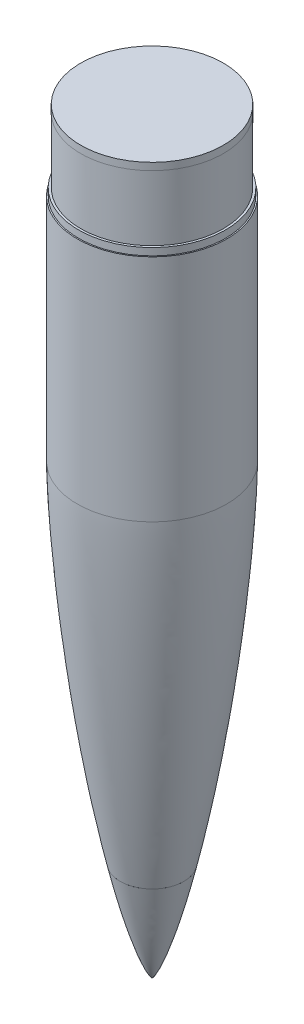
ISO-10303-21;
HEADER;
FILE_DESCRIPTION(('STEP AP214'),'2;1');
FILE_NAME('part.step','',(''),(''),'','','');
FILE_SCHEMA(('AUTOMOTIVE_DESIGN { 1 0 10303 214 1 1 1 1 }'));
ENDSEC;
DATA;
#1=APPLICATION_CONTEXT('core data for automotive mechanical design processes');
#2=APPLICATION_PROTOCOL_DEFINITION('international standard','automotive_design',2000,#1);
#3=PRODUCT_CONTEXT('',#1,'mechanical');
#4=PRODUCT('Part','Part','',(#3));
#5=PRODUCT_RELATED_PRODUCT_CATEGORY('part','',(#4));
#6=PRODUCT_DEFINITION_FORMATION('','',#4);
#7=PRODUCT_DEFINITION_CONTEXT('part definition',#1,'design');
#8=PRODUCT_DEFINITION('design','',#6,#7);
#9=PRODUCT_DEFINITION_SHAPE('','',#8);
#10=(LENGTH_UNIT() NAMED_UNIT(*) SI_UNIT(.MILLI.,.METRE.));
#11=(NAMED_UNIT(*) PLANE_ANGLE_UNIT() SI_UNIT($,.RADIAN.));
#12=(NAMED_UNIT(*) SI_UNIT($,.STERADIAN.) SOLID_ANGLE_UNIT());
#13=UNCERTAINTY_MEASURE_WITH_UNIT(LENGTH_MEASURE(1.E-05),#10,'distance_accuracy_value','');
#14=(GEOMETRIC_REPRESENTATION_CONTEXT(3) GLOBAL_UNCERTAINTY_ASSIGNED_CONTEXT((#13)) GLOBAL_UNIT_ASSIGNED_CONTEXT((#10,
#11,#12)) REPRESENTATION_CONTEXT('',''));
#15=CARTESIAN_POINT('',(0.,0.,0.));
#16=DIRECTION('',(0.,0.,1.));
#17=DIRECTION('',(1.,0.,0.));
#18=AXIS2_PLACEMENT_3D('',#15,#16,#17);
#19=CARTESIAN_POINT('',(0.,518.77656692154,0.));
#20=DIRECTION('',(0.,1.,0.));
#21=DIRECTION('',(0.,0.,1.));
#22=AXIS2_PLACEMENT_3D('',#19,#20,#21);
#23=PLANE('',#22);
#24=CARTESIAN_POINT('',(0.,518.77656692154,0.));
#25=DIRECTION('',(0.,-1.,0.));
#26=DIRECTION('',(0.,0.,-1.));
#27=AXIS2_PLACEMENT_3D('',#24,#25,#26);
#28=CIRCLE('',#27,44.3431943802182);
#29=CARTESIAN_POINT('',(0.,518.77656692154,-44.3431943802182));
#30=VERTEX_POINT('',#29);
#31=EDGE_CURVE('E76',#30,#30,#28,.T.);
#32=ORIENTED_EDGE('',*,*,#31,.T.);
#33=EDGE_LOOP('',(#32));
#34=FACE_BOUND('',#33,.T.);
#35=CARTESIAN_POINT('',(0.,518.77656692154,0.));
#36=DIRECTION('',(0.,-1.,0.));
#37=DIRECTION('',(0.,0.,-1.));
#38=AXIS2_PLACEMENT_3D('',#35,#36,#37);
#39=CIRCLE('',#38,49.3431943802182);
#40=CARTESIAN_POINT('',(0.,518.77656692154,-49.3431943802182));
#41=VERTEX_POINT('',#40);
#42=EDGE_CURVE('E59',#41,#41,#39,.T.);
#43=ORIENTED_EDGE('',*,*,#42,.F.);
#44=EDGE_LOOP('',(#43));
#45=FACE_BOUND('',#44,.T.);
#46=ADVANCED_FACE('F52',(#34,#45),#23,.T.);
#47=CARTESIAN_POINT('',(0.,-29.8063048469794,0.));
#48=DIRECTION('',(0.,-1.,0.));
#49=DIRECTION('',(0.,0.,-1.));
#50=AXIS2_PLACEMENT_3D('',#47,#48,#49);
#51=CYLINDRICAL_SURFACE('',#50,44.3431943802182);
#52=ORIENTED_EDGE('',*,*,#31,.F.);
#53=EDGE_LOOP('',(#52));
#54=FACE_BOUND('',#53,.T.);
#55=CARTESIAN_POINT('',(0.,468.772338597505,0.));
#56=DIRECTION('',(0.,-1.,0.));
#57=DIRECTION('',(0.,0.,-1.));
#58=AXIS2_PLACEMENT_3D('',#55,#56,#57);
#59=CIRCLE('',#58,44.3431943802182);
#60=CARTESIAN_POINT('',(0.,468.772338597505,-44.3431943802182));
#61=VERTEX_POINT('',#60);
#62=EDGE_CURVE('E80',#61,#61,#59,.T.);
#63=ORIENTED_EDGE('',*,*,#62,.T.);
#64=EDGE_LOOP('',(#63));
#65=FACE_BOUND('',#64,.T.);
#66=ADVANCED_FACE('F111',(#54,#65),#51,.F.);
#67=CARTESIAN_POINT('',(0.,-29.8063048469794,0.));
#68=DIRECTION('',(0.,-1.,0.));
#69=DIRECTION('',(0.,0.,-1.));
#70=AXIS2_PLACEMENT_3D('',#67,#68,#69);
#71=CYLINDRICAL_SURFACE('',#70,49.3431943802182);
#72=CARTESIAN_POINT('',(0.,473.772338597505,0.));
#73=DIRECTION('',(0.,1.,0.));
#74=DIRECTION('',(0.,0.,1.));
#75=AXIS2_PLACEMENT_3D('',#72,#73,#74);
#76=CIRCLE('',#75,49.3431943802182);
#77=CARTESIAN_POINT('',(0.,473.772338597505,49.3431943802182));
#78=VERTEX_POINT('',#77);
#79=EDGE_CURVE('E12',#78,#78,#76,.F.);
#80=ORIENTED_EDGE('',*,*,#79,.F.);
#81=EDGE_LOOP('',(#80));
#82=FACE_BOUND('',#81,.T.);
#83=ORIENTED_EDGE('',*,*,#42,.T.);
#84=EDGE_LOOP('',(#83));
#85=FACE_BOUND('',#84,.T.);
#86=ADVANCED_FACE('F116',(#82,#85),#71,.T.);
#87=CARTESIAN_POINT('',(0.,391.215771675965,0.));
#88=DIRECTION('',(0.,1.,0.));
#89=DIRECTION('',(0.,0.,1.));
#90=AXIS2_PLACEMENT_3D('',#87,#88,#89);
#91=PLANE('',#90);
#92=CARTESIAN_POINT('',(0.,391.215771675965,0.));
#93=DIRECTION('',(0.,-1.,0.));
#94=DIRECTION('',(0.,0.,-1.));
#95=AXIS2_PLACEMENT_3D('',#92,#93,#94);
#96=CIRCLE('',#95,44.33);
#97=CARTESIAN_POINT('',(0.,391.215771675965,-44.33));
#98=VERTEX_POINT('',#97);
#99=EDGE_CURVE('E85',#98,#98,#96,.T.);
#100=ORIENTED_EDGE('',*,*,#99,.F.);
#101=EDGE_LOOP('',(#100));
#102=FACE_BOUND('',#101,.T.);
#103=CARTESIAN_POINT('',(0.,391.215771675965,0.));
#104=DIRECTION('',(0.,-1.,0.));
#105=DIRECTION('',(0.,0.,-1.));
#106=AXIS2_PLACEMENT_3D('',#103,#104,#105);
#107=CIRCLE('',#106,49.33);
#108=CARTESIAN_POINT('',(0.,391.215771675965,-49.33));
#109=VERTEX_POINT('',#108);
#110=EDGE_CURVE('E68',#109,#109,#107,.T.);
#111=ORIENTED_EDGE('',*,*,#110,.T.);
#112=EDGE_LOOP('',(#111));
#113=FACE_BOUND('',#112,.T.);
#114=ADVANCED_FACE('F92',(#102,#113),#91,.F.);
#115=CARTESIAN_POINT('',(0.,391.215771675965,0.));
#116=DIRECTION('',(0.,1.,0.));
#117=DIRECTION('',(0.,0.,1.));
#118=AXIS2_PLACEMENT_3D('',#115,#116,#117);
#119=CONICAL_SURFACE('',#118,44.33,0.000170125891521534);
#120=ORIENTED_EDGE('',*,*,#62,.F.);
#121=EDGE_LOOP('',(#120));
#122=FACE_BOUND('',#121,.T.);
#123=ORIENTED_EDGE('',*,*,#99,.T.);
#124=EDGE_LOOP('',(#123));
#125=FACE_BOUND('',#124,.T.);
#126=ADVANCED_FACE('F98',(#122,#125),#119,.F.);
#127=CARTESIAN_POINT('',(0.,468.772338597505,0.));
#128=DIRECTION('',(0.,1.,0.));
#129=DIRECTION('',(0.,0.,1.));
#130=AXIS2_PLACEMENT_3D('',#127,#128,#129);
#131=CONICAL_SURFACE('',#130,49.3431943802182,0.000170125891522071);
#132=ORIENTED_EDGE('',*,*,#110,.F.);
#133=EDGE_LOOP('',(#132));
#134=FACE_BOUND('',#133,.T.);
#135=CARTESIAN_POINT('',(0.,468.772338597505,0.));
#136=DIRECTION('',(0.,-1.,0.));
#137=DIRECTION('',(0.,0.,-1.));
#138=AXIS2_PLACEMENT_3D('',#135,#136,#137);
#139=CIRCLE('',#138,49.3431943802182);
#140=CARTESIAN_POINT('',(0.,468.772338597505,-49.3431943802182));
#141=VERTEX_POINT('',#140);
#142=EDGE_CURVE('E63',#141,#141,#139,.T.);
#143=ORIENTED_EDGE('',*,*,#142,.T.);
#144=EDGE_LOOP('',(#143));
#145=FACE_BOUND('',#144,.T.);
#146=ADVANCED_FACE('F94',(#134,#145),#131,.T.);
#147=CARTESIAN_POINT('',(0.,-29.8063048469794,0.));
#148=DIRECTION('',(0.,-1.,0.));
#149=DIRECTION('',(0.,0.,-1.));
#150=AXIS2_PLACEMENT_3D('',#147,#148,#149);
#151=CYLINDRICAL_SURFACE('',#150,50.854);
#152=CARTESIAN_POINT('',(0.,473.772338597505,0.));
#153=DIRECTION('',(0.,-1.,0.));
#154=DIRECTION('',(0.,0.,-1.));
#155=AXIS2_PLACEMENT_3D('',#152,#153,#154);
#156=CIRCLE('',#155,50.854);
#157=CARTESIAN_POINT('',(0.,473.772338597505,-50.854));
#158=VERTEX_POINT('',#157);
#159=EDGE_CURVE('E72',#158,#158,#156,.T.);
#160=ORIENTED_EDGE('',*,*,#159,.T.);
#161=EDGE_LOOP('',(#160));
#162=FACE_BOUND('',#161,.T.);
#163=CARTESIAN_POINT('',(0.,468.772338597505,0.));
#164=DIRECTION('',(0.,-1.,0.));
#165=DIRECTION('',(0.,0.,-1.));
#166=AXIS2_PLACEMENT_3D('',#163,#164,#165);
#167=CIRCLE('',#166,50.854);
#168=CARTESIAN_POINT('',(0.,468.772338597505,-50.854));
#169=VERTEX_POINT('',#168);
#170=EDGE_CURVE('E74',#169,#169,#167,.T.);
#171=ORIENTED_EDGE('',*,*,#170,.F.);
#172=EDGE_LOOP('',(#171));
#173=FACE_BOUND('',#172,.T.);
#174=ADVANCED_FACE('F97',(#162,#173),#151,.T.);
#175=CARTESIAN_POINT('',(-50.854,468.772338597505,0.));
#176=DIRECTION('',(0.,1.,0.));
#177=DIRECTION('',(0.,0.,1.));
#178=AXIS2_PLACEMENT_3D('',#175,#176,#177);
#179=PLANE('',#178);
#180=ORIENTED_EDGE('',*,*,#170,.T.);
#181=EDGE_LOOP('',(#180));
#182=FACE_BOUND('',#181,.T.);
#183=ORIENTED_EDGE('',*,*,#142,.F.);
#184=EDGE_LOOP('',(#183));
#185=FACE_BOUND('',#184,.T.);
#186=ADVANCED_FACE('F54',(#182,#185),#179,.F.);
#187=CARTESIAN_POINT('',(-50.854,473.772338597505,0.));
#188=DIRECTION('',(0.,1.,0.));
#189=DIRECTION('',(0.,0.,1.));
#190=AXIS2_PLACEMENT_3D('',#187,#188,#189);
#191=PLANE('',#190);
#192=ORIENTED_EDGE('',*,*,#79,.T.);
#193=EDGE_LOOP('',(#192));
#194=FACE_BOUND('',#193,.T.);
#195=ORIENTED_EDGE('',*,*,#159,.F.);
#196=EDGE_LOOP('',(#195));
#197=FACE_BOUND('',#196,.T.);
#198=ADVANCED_FACE('F103',(#194,#197),#191,.T.);
#199=CLOSED_SHELL('',(#46,#66,#86,#114,#126,#146,#174,#186,#198));
#200=MANIFOLD_SOLID_BREP('B2',#199);
#201=CARTESIAN_POINT('',(1.17849849743117E-12,523.77656692154,0.));
#202=DIRECTION('',(0.,1.,0.));
#203=DIRECTION('',(0.,0.,1.));
#204=AXIS2_PLACEMENT_3D('',#201,#202,#203);
#205=PLANE('',#204);
#206=CARTESIAN_POINT('',(0.,523.77656692154,0.));
#207=DIRECTION('',(0.,-1.,0.));
#208=DIRECTION('',(0.,0.,-1.));
#209=AXIS2_PLACEMENT_3D('',#206,#207,#208);
#210=CIRCLE('',#209,49.3431943802182);
#211=CARTESIAN_POINT('',(0.,523.77656692154,-49.3431943802182));
#212=VERTEX_POINT('',#211);
#213=EDGE_CURVE('E51',#212,#212,#210,.T.);
#214=ORIENTED_EDGE('',*,*,#213,.F.);
#215=EDGE_LOOP('',(#214));
#216=FACE_BOUND('',#215,.T.);
#217=ADVANCED_FACE('F203',(#216),#205,.T.);
#218=CARTESIAN_POINT('',(0.,-29.8063048469794,0.));
#219=DIRECTION('',(0.,-1.,0.));
#220=DIRECTION('',(0.,0.,-1.));
#221=AXIS2_PLACEMENT_3D('',#218,#219,#220);
#222=CYLINDRICAL_SURFACE('',#221,49.3431943802182);
#223=ORIENTED_EDGE('',*,*,#213,.T.);
#224=EDGE_LOOP('',(#223));
#225=FACE_BOUND('',#224,.T.);
#226=CARTESIAN_POINT('',(0.,518.77656692154,0.));
#227=DIRECTION('',(0.,-1.,0.));
#228=DIRECTION('',(0.,0.,-1.));
#229=AXIS2_PLACEMENT_3D('',#226,#227,#228);
#230=CIRCLE('',#229,49.3431943802182);
#231=CARTESIAN_POINT('',(0.,518.77656692154,-49.3431943802182));
#232=VERTEX_POINT('',#231);
#233=EDGE_CURVE('E209',#232,#232,#230,.T.);
#234=ORIENTED_EDGE('',*,*,#233,.F.);
#235=EDGE_LOOP('',(#234));
#236=FACE_BOUND('',#235,.T.);
#237=ADVANCED_FACE('F246',(#225,#236),#222,.T.);
#238=CARTESIAN_POINT('',(0.,518.77656692154,0.));
#239=DIRECTION('',(0.,1.,0.));
#240=DIRECTION('',(0.,0.,1.));
#241=AXIS2_PLACEMENT_3D('',#238,#239,#240);
#242=PLANE('',#241);
#243=CARTESIAN_POINT('',(0.,518.77656692154,0.));
#244=DIRECTION('',(0.,-1.,0.));
#245=DIRECTION('',(0.,0.,-1.));
#246=AXIS2_PLACEMENT_3D('',#243,#244,#245);
#247=CIRCLE('',#246,44.0931943802182);
#248=CARTESIAN_POINT('',(0.,518.77656692154,-44.0931943802182));
#249=VERTEX_POINT('',#248);
#250=EDGE_CURVE('E213',#249,#249,#247,.T.);
#251=ORIENTED_EDGE('',*,*,#250,.F.);
#252=EDGE_LOOP('',(#251));
#253=FACE_BOUND('',#252,.T.);
#254=ORIENTED_EDGE('',*,*,#233,.T.);
#255=EDGE_LOOP('',(#254));
#256=FACE_BOUND('',#255,.T.);
#257=ADVANCED_FACE('F241',(#253,#256),#242,.F.);
#258=CARTESIAN_POINT('',(0.,-29.8063048469794,0.));
#259=DIRECTION('',(0.,-1.,0.));
#260=DIRECTION('',(0.,0.,-1.));
#261=AXIS2_PLACEMENT_3D('',#258,#259,#260);
#262=CYLINDRICAL_SURFACE('',#261,44.0931943802182);
#263=CARTESIAN_POINT('',(0.,474.306974890155,0.));
#264=DIRECTION('',(0.,-1.,0.));
#265=DIRECTION('',(0.,0.,-1.));
#266=AXIS2_PLACEMENT_3D('',#263,#264,#265);
#267=CIRCLE('',#266,44.0931943802182);
#268=CARTESIAN_POINT('',(0.,474.306974890155,-44.0931943802182));
#269=VERTEX_POINT('',#268);
#270=EDGE_CURVE('E217',#269,#269,#267,.T.);
#271=ORIENTED_EDGE('',*,*,#270,.F.);
#272=EDGE_LOOP('',(#271));
#273=FACE_BOUND('',#272,.T.);
#274=ORIENTED_EDGE('',*,*,#250,.T.);
#275=EDGE_LOOP('',(#274));
#276=FACE_BOUND('',#275,.T.);
#277=ADVANCED_FACE('F242',(#273,#276),#262,.T.);
#278=CARTESIAN_POINT('',(0.,474.306974890155,0.));
#279=DIRECTION('',(0.,-1.,0.));
#280=DIRECTION('',(0.,0.,-1.));
#281=AXIS2_PLACEMENT_3D('',#278,#279,#280);
#282=PLANE('',#281);
#283=ORIENTED_EDGE('',*,*,#270,.T.);
#284=EDGE_LOOP('',(#283));
#285=FACE_BOUND('',#284,.T.);
#286=CARTESIAN_POINT('',(0.,474.306974890155,0.));
#287=DIRECTION('',(0.,-1.,0.));
#288=DIRECTION('',(0.,0.,-1.));
#289=AXIS2_PLACEMENT_3D('',#286,#287,#288);
#290=CIRCLE('',#289,39.0931943802182);
#291=CARTESIAN_POINT('',(0.,474.306974890155,-39.0931943802182));
#292=VERTEX_POINT('',#291);
#293=EDGE_CURVE('E222',#292,#292,#290,.T.);
#294=ORIENTED_EDGE('',*,*,#293,.F.);
#295=EDGE_LOOP('',(#294));
#296=FACE_BOUND('',#295,.T.);
#297=ADVANCED_FACE('F233',(#285,#296),#282,.T.);
#298=CARTESIAN_POINT('',(0.,-29.8063048469794,0.));
#299=DIRECTION('',(0.,-1.,0.));
#300=DIRECTION('',(0.,0.,-1.));
#301=AXIS2_PLACEMENT_3D('',#298,#299,#300);
#302=CYLINDRICAL_SURFACE('',#301,39.0931943802182);
#303=ORIENTED_EDGE('',*,*,#293,.T.);
#304=EDGE_LOOP('',(#303));
#305=FACE_BOUND('',#304,.T.);
#306=CARTESIAN_POINT('',(0.,518.77656692154,0.));
#307=DIRECTION('',(0.,-1.,0.));
#308=DIRECTION('',(0.,0.,-1.));
#309=AXIS2_PLACEMENT_3D('',#306,#307,#308);
#310=CIRCLE('',#309,39.0931943802182);
#311=CARTESIAN_POINT('',(0.,518.77656692154,-39.0931943802182));
#312=VERTEX_POINT('',#311);
#313=EDGE_CURVE('E225',#312,#312,#310,.T.);
#314=ORIENTED_EDGE('',*,*,#313,.F.);
#315=EDGE_LOOP('',(#314));
#316=FACE_BOUND('',#315,.T.);
#317=ADVANCED_FACE('F231',(#305,#316),#302,.F.);
#318=ORIENTED_EDGE('',*,*,#313,.T.);
#319=EDGE_LOOP('',(#318));
#320=FACE_BOUND('',#319,.T.);
#321=ADVANCED_FACE('F229',(#320),#242,.F.);
#322=CLOSED_SHELL('',(#217,#237,#257,#277,#297,#317,#321));
#323=MANIFOLD_SOLID_BREP('B7',#322);
#324=CARTESIAN_POINT('',(0.,291.115771675965,0.));
#325=DIRECTION('',(0.,-1.,0.));
#326=DIRECTION('',(0.,0.,-1.));
#327=AXIS2_PLACEMENT_3D('',#324,#325,#326);
#328=PLANE('',#327);
#329=CARTESIAN_POINT('',(0.,291.115771675965,0.));
#330=DIRECTION('',(0.,1.,0.));
#331=DIRECTION('',(0.,0.,1.));
#332=AXIS2_PLACEMENT_3D('',#329,#330,#331);
#333=CIRCLE('',#332,49.33);
#334=CARTESIAN_POINT('',(0.,291.115771675965,49.33));
#335=VERTEX_POINT('',#334);
#336=EDGE_CURVE('E331',#335,#335,#333,.T.);
#337=ORIENTED_EDGE('',*,*,#336,.F.);
#338=EDGE_LOOP('',(#337));
#339=FACE_BOUND('',#338,.T.);
#340=CARTESIAN_POINT('',(0.,291.115771675965,0.));
#341=DIRECTION('',(0.,1.,0.));
#342=DIRECTION('',(0.,0.,1.));
#343=AXIS2_PLACEMENT_3D('',#340,#341,#342);
#344=CIRCLE('',#343,50.6801224597925);
#345=CARTESIAN_POINT('',(0.,291.115771675965,50.6801224597924));
#346=VERTEX_POINT('',#345);
#347=EDGE_CURVE('E202',#346,#346,#344,.T.);
#348=ORIENTED_EDGE('',*,*,#347,.T.);
#349=EDGE_LOOP('',(#348));
#350=FACE_BOUND('',#349,.T.);
#351=ADVANCED_FACE('F317',(#339,#350),#328,.F.);
#352=CARTESIAN_POINT('',(0.,291.115771675965,0.));
#353=DIRECTION('',(0.,-1.,0.));
#354=DIRECTION('',(0.,0.,-1.));
#355=AXIS2_PLACEMENT_3D('',#352,#353,#354);
#356=CONICAL_SURFACE('',#355,50.6801224597925,0.115403305406026);
#357=CARTESIAN_POINT('',(0.,289.615771675965,0.));
#358=DIRECTION('',(0.,1.,0.));
#359=DIRECTION('',(0.,0.,1.));
#360=AXIS2_PLACEMENT_3D('',#357,#358,#359);
#361=CIRCLE('',#360,50.854);
#362=CARTESIAN_POINT('',(0.,289.615771675965,50.854));
#363=VERTEX_POINT('',#362);
#364=EDGE_CURVE('E323',#363,#363,#361,.T.);
#365=ORIENTED_EDGE('',*,*,#364,.T.);
#366=EDGE_LOOP('',(#365));
#367=FACE_BOUND('',#366,.T.);
#368=ORIENTED_EDGE('',*,*,#347,.F.);
#369=EDGE_LOOP('',(#368));
#370=FACE_BOUND('',#369,.T.);
#371=ADVANCED_FACE('F341',(#367,#370),#356,.T.);
#372=CARTESIAN_POINT('',(0.,289.615771675965,0.));
#373=DIRECTION('',(0.,-1.,0.));
#374=DIRECTION('',(0.,0.,-1.));
#375=AXIS2_PLACEMENT_3D('',#372,#373,#374);
#376=PLANE('',#375);
#377=CARTESIAN_POINT('',(0.,289.615771675965,0.));
#378=DIRECTION('',(0.,1.,0.));
#379=DIRECTION('',(0.,0.,1.));
#380=AXIS2_PLACEMENT_3D('',#377,#378,#379);
#381=CIRCLE('',#380,49.33);
#382=CARTESIAN_POINT('',(0.,289.615771675965,49.33));
#383=VERTEX_POINT('',#382);
#384=EDGE_CURVE('E327',#383,#383,#381,.T.);
#385=ORIENTED_EDGE('',*,*,#384,.T.);
#386=EDGE_LOOP('',(#385));
#387=FACE_BOUND('',#386,.T.);
#388=ORIENTED_EDGE('',*,*,#364,.F.);
#389=EDGE_LOOP('',(#388));
#390=FACE_BOUND('',#389,.T.);
#391=ADVANCED_FACE('F345',(#387,#390),#376,.T.);
#392=CARTESIAN_POINT('',(0.,393.715771675965,0.));
#393=DIRECTION('',(0.,1.,0.));
#394=DIRECTION('',(0.,0.,1.));
#395=AXIS2_PLACEMENT_3D('',#392,#393,#394);
#396=CYLINDRICAL_SURFACE('',#395,49.33);
#397=ORIENTED_EDGE('',*,*,#336,.T.);
#398=EDGE_LOOP('',(#397));
#399=FACE_BOUND('',#398,.T.);
#400=ORIENTED_EDGE('',*,*,#384,.F.);
#401=EDGE_LOOP('',(#400));
#402=FACE_BOUND('',#401,.T.);
#403=ADVANCED_FACE('F337',(#399,#402),#396,.F.);
#404=CLOSED_SHELL('',(#351,#371,#391,#403));
#405=MANIFOLD_SOLID_BREP('B46',#404);
#406=CARTESIAN_POINT('',(0.,393.715771675965,0.));
#407=DIRECTION('',(0.,1.,0.));
#408=DIRECTION('',(0.,0.,1.));
#409=AXIS2_PLACEMENT_3D('',#406,#407,#408);
#410=CYLINDRICAL_SURFACE('',#409,49.33);
#411=CARTESIAN_POINT('',(0.,302.762955592135,0.));
#412=DIRECTION('',(0.,1.,0.));
#413=DIRECTION('',(0.,0.,1.));
#414=AXIS2_PLACEMENT_3D('',#411,#412,#413);
#415=CIRCLE('',#414,49.33);
#416=CARTESIAN_POINT('',(0.,302.762955592135,49.33));
#417=VERTEX_POINT('',#416);
#418=EDGE_CURVE('E412',#417,#417,#415,.T.);
#419=ORIENTED_EDGE('',*,*,#418,.T.);
#420=EDGE_LOOP('',(#419));
#421=FACE_BOUND('',#420,.T.);
#422=CARTESIAN_POINT('',(0.,309.892338597505,0.));
#423=DIRECTION('',(0.,1.,0.));
#424=DIRECTION('',(0.,0.,1.));
#425=AXIS2_PLACEMENT_3D('',#422,#423,#424);
#426=CIRCLE('',#425,49.33);
#427=CARTESIAN_POINT('',(0.,309.892338597505,49.33));
#428=VERTEX_POINT('',#427);
#429=EDGE_CURVE('E316',#428,#428,#426,.T.);
#430=ORIENTED_EDGE('',*,*,#429,.F.);
#431=EDGE_LOOP('',(#430));
#432=FACE_BOUND('',#431,.T.);
#433=ADVANCED_FACE('F389',(#421,#432),#410,.T.);
#434=CARTESIAN_POINT('',(0.,309.893796776163,0.));
#435=DIRECTION('',(0.,-1.,0.));
#436=DIRECTION('',(0.,0.,-1.));
#437=AXIS2_PLACEMENT_3D('',#434,#435,#436);
#438=CONICAL_SURFACE('',#437,48.5034045835404,0.115403305406029);
#439=ORIENTED_EDGE('',*,*,#418,.F.);
#440=EDGE_LOOP('',(#439));
#441=FACE_BOUND('',#440,.T.);
#442=CARTESIAN_POINT('',(0.,309.893796776163,0.));
#443=DIRECTION('',(0.,1.,0.));
#444=DIRECTION('',(0.,0.,1.));
#445=AXIS2_PLACEMENT_3D('',#442,#443,#444);
#446=CIRCLE('',#445,48.5034045835404);
#447=CARTESIAN_POINT('',(0.,309.893796776163,48.5034045835403));
#448=VERTEX_POINT('',#447);
#449=EDGE_CURVE('E396',#448,#448,#446,.T.);
#450=ORIENTED_EDGE('',*,*,#449,.T.);
#451=EDGE_LOOP('',(#450));
#452=FACE_BOUND('',#451,.T.);
#453=ADVANCED_FACE('F391',(#441,#452),#438,.F.);
#454=CARTESIAN_POINT('',(0.,309.893796776163,48.5034045835403));
#455=CARTESIAN_POINT('',(0.,309.647322482945,48.5016075180047));
#456=CARTESIAN_POINT('',(0.,309.391933611992,48.4985917938472));
#457=CARTESIAN_POINT('',(0.,308.882202850884,48.4922331284798));
#458=CARTESIAN_POINT('',(0.,308.627899117998,48.4887016398019));
#459=CARTESIAN_POINT('',(0.,307.864628654927,48.4768694817913));
#460=CARTESIAN_POINT('',(0.,307.354464604494,48.4673702153932));
#461=CARTESIAN_POINT('',(0.,305.821248175436,48.4357566915213));
#462=CARTESIAN_POINT('',(0.,304.797655619183,48.4105990196266));
#463=CARTESIAN_POINT('',(0.,301.725239654702,48.3255096922668));
#464=CARTESIAN_POINT('',(0.,299.674249316984,48.256509890137));
#465=CARTESIAN_POINT('',(0.,293.520023966016,48.0229907485952));
#466=CARTESIAN_POINT('',(0.,289.414629795604,47.8320462314855));
#467=CARTESIAN_POINT('',(0.,277.09870218236,47.1827957278391));
#468=CARTESIAN_POINT('',(0.,268.888283123903,46.6481639125436));
#469=CARTESIAN_POINT('',(0.,252.476043401837,45.426677993898));
#470=CARTESIAN_POINT('',(0.,244.273981404085,44.7384534948352));
#471=CARTESIAN_POINT('',(0.,227.881089137087,43.2259245061395));
#472=CARTESIAN_POINT('',(0.,219.690258658558,42.4013334897002));
#473=CARTESIAN_POINT('',(0.,195.138170649776,39.7336180376818));
#474=CARTESIAN_POINT('',(0.,178.797133711404,37.6987952667338));
#475=CARTESIAN_POINT('',(0.,146.192779138396,33.102822392286));
#476=CARTESIAN_POINT('',(0.,129.928805317099,30.5429377648144));
#477=CARTESIAN_POINT('',(0.,113.725937901366,27.6679945804726));
#478=B_SPLINE_CURVE_WITH_KNOTS('',3,(#454,#455,#456,#457,#458,#459,#460,#461,#462,#463,#464,
#465,#466,#467,#468,#469,#470,#471,#472,#473,#474,#475,#476,#477),.UNSPECIFIED.,.F.,.F.,(4,2,2,
2,2,2,2,2,2,2,2,4),(0.,0.00390624999999979,0.00781249999999959,0.0156249999999992,
0.0312499999999992,0.0624999999999992,0.124999999999999,0.25,0.375,0.5,0.75,1.),.UNSPECIFIED.);
#479=CARTESIAN_POINT('',(0.,393.715771675965,0.));
#480=DIRECTION('',(0.,1.,0.));
#481=AXIS1_PLACEMENT('',#479,#480);
#482=SURFACE_OF_REVOLUTION('',#478,#481);
#483=CARTESIAN_POINT('',(0.,251.112470653971,0.));
#484=DIRECTION('',(0.,1.,0.));
#485=DIRECTION('',(0.,0.,1.));
#486=AXIS2_PLACEMENT_3D('',#483,#484,#485);
#487=CIRCLE('',#486,45.2904671850234);
#488=CARTESIAN_POINT('',(0.,251.112470653971,45.2904671850234));
#489=VERTEX_POINT('',#488);
#490=EDGE_CURVE('E400',#489,#489,#487,.T.);
#491=ORIENTED_EDGE('',*,*,#490,.T.);
#492=EDGE_LOOP('',(#491));
#493=FACE_BOUND('',#492,.T.);
#494=ORIENTED_EDGE('',*,*,#449,.F.);
#495=EDGE_LOOP('',(#494));
#496=FACE_BOUND('',#495,.T.);
#497=ADVANCED_FACE('F424',(#493,#496),#482,.F.);
#498=CARTESIAN_POINT('',(0.,269.615771675965,0.));
#499=DIRECTION('',(0.,-1.,0.));
#500=DIRECTION('',(0.,0.,-1.));
#501=AXIS2_PLACEMENT_3D('',#498,#499,#500);
#502=CONICAL_SURFACE('',#501,44.33,0.0518613375597485);
#503=ORIENTED_EDGE('',*,*,#490,.F.);
#504=EDGE_LOOP('',(#503));
#505=FACE_BOUND('',#504,.T.);
#506=CARTESIAN_POINT('',(0.,269.615771675965,0.));
#507=DIRECTION('',(0.,1.,0.));
#508=DIRECTION('',(0.,0.,1.));
#509=AXIS2_PLACEMENT_3D('',#506,#507,#508);
#510=CIRCLE('',#509,44.33);
#511=CARTESIAN_POINT('',(0.,269.615771675965,44.33));
#512=VERTEX_POINT('',#511);
#513=EDGE_CURVE('E404',#512,#512,#510,.T.);
#514=ORIENTED_EDGE('',*,*,#513,.T.);
#515=EDGE_LOOP('',(#514));
#516=FACE_BOUND('',#515,.T.);
#517=ADVANCED_FACE('F427',(#505,#516),#502,.F.);
#518=CARTESIAN_POINT('',(0.,393.715771675965,0.));
#519=DIRECTION('',(0.,1.,0.));
#520=DIRECTION('',(0.,0.,1.));
#521=AXIS2_PLACEMENT_3D('',#518,#519,#520);
#522=CYLINDRICAL_SURFACE('',#521,44.33);
#523=ORIENTED_EDGE('',*,*,#513,.F.);
#524=EDGE_LOOP('',(#523));
#525=FACE_BOUND('',#524,.T.);
#526=CARTESIAN_POINT('',(0.,391.215771675965,0.));
#527=DIRECTION('',(0.,1.,0.));
#528=DIRECTION('',(0.,0.,1.));
#529=AXIS2_PLACEMENT_3D('',#526,#527,#528);
#530=CIRCLE('',#529,44.33);
#531=CARTESIAN_POINT('',(0.,391.215771675965,44.33));
#532=VERTEX_POINT('',#531);
#533=EDGE_CURVE('E409',#532,#532,#530,.T.);
#534=ORIENTED_EDGE('',*,*,#533,.T.);
#535=EDGE_LOOP('',(#534));
#536=FACE_BOUND('',#535,.T.);
#537=ADVANCED_FACE('F431',(#525,#536),#522,.F.);
#538=CARTESIAN_POINT('',(0.,391.215771675965,0.));
#539=DIRECTION('',(0.,-1.,0.));
#540=DIRECTION('',(0.,0.,-1.));
#541=AXIS2_PLACEMENT_3D('',#538,#539,#540);
#542=PLANE('',#541);
#543=ORIENTED_EDGE('',*,*,#533,.F.);
#544=EDGE_LOOP('',(#543));
#545=FACE_BOUND('',#544,.T.);
#546=CARTESIAN_POINT('',(0.,391.215771675965,0.));
#547=DIRECTION('',(0.,-1.,0.));
#548=DIRECTION('',(0.,0.,-1.));
#549=AXIS2_PLACEMENT_3D('',#546,#547,#548);
#550=CIRCLE('',#549,49.33);
#551=CARTESIAN_POINT('',(0.,391.215771675965,-49.33));
#552=VERTEX_POINT('',#551);
#553=EDGE_CURVE('E415',#552,#552,#550,.T.);
#554=ORIENTED_EDGE('',*,*,#553,.F.);
#555=EDGE_LOOP('',(#554));
#556=FACE_BOUND('',#555,.T.);
#557=ADVANCED_FACE('F435',(#545,#556),#542,.F.);
#558=CARTESIAN_POINT('',(0.,-29.8063048469794,0.));
#559=DIRECTION('',(0.,-1.,0.));
#560=DIRECTION('',(0.,0.,-1.));
#561=AXIS2_PLACEMENT_3D('',#558,#559,#560);
#562=CYLINDRICAL_SURFACE('',#561,49.33);
#563=CARTESIAN_POINT('',(0.,468.772338597505,0.));
#564=DIRECTION('',(0.,-1.,0.));
#565=DIRECTION('',(0.,0.,-1.));
#566=AXIS2_PLACEMENT_3D('',#563,#564,#565);
#567=CIRCLE('',#566,49.33);
#568=CARTESIAN_POINT('',(0.,468.772338597505,-49.33));
#569=VERTEX_POINT('',#568);
#570=EDGE_CURVE('E466',#569,#569,#567,.T.);
#571=ORIENTED_EDGE('',*,*,#570,.F.);
#572=EDGE_LOOP('',(#571));
#573=FACE_BOUND('',#572,.T.);
#574=ORIENTED_EDGE('',*,*,#553,.T.);
#575=EDGE_LOOP('',(#574));
#576=FACE_BOUND('',#575,.T.);
#577=ADVANCED_FACE('F439',(#573,#576),#562,.F.);
#578=CARTESIAN_POINT('',(-51.7034756527029,309.892338597505,0.));
#579=DIRECTION('',(0.,1.,0.));
#580=DIRECTION('',(0.,0.,1.));
#581=AXIS2_PLACEMENT_3D('',#578,#579,#580);
#582=PLANE('',#581);
#583=ORIENTED_EDGE('',*,*,#429,.T.);
#584=EDGE_LOOP('',(#583));
#585=FACE_BOUND('',#584,.T.);
#586=CARTESIAN_POINT('',(0.,309.892338597505,0.));
#587=DIRECTION('',(0.,-1.,0.));
#588=DIRECTION('',(0.,0.,-1.));
#589=AXIS2_PLACEMENT_3D('',#586,#587,#588);
#590=CIRCLE('',#589,51.7034756527029);
#591=CARTESIAN_POINT('',(0.,309.892338597505,-51.7034756527029));
#592=VERTEX_POINT('',#591);
#593=EDGE_CURVE('E462',#592,#592,#590,.T.);
#594=ORIENTED_EDGE('',*,*,#593,.T.);
#595=EDGE_LOOP('',(#594));
#596=FACE_BOUND('',#595,.T.);
#597=ADVANCED_FACE('F444',(#585,#596),#582,.F.);
#598=CARTESIAN_POINT('',(-51.7034756527029,468.772338597505,0.));
#599=DIRECTION('',(0.,-1.,0.));
#600=DIRECTION('',(0.,0.,-1.));
#601=AXIS2_PLACEMENT_3D('',#598,#599,#600);
#602=PLANE('',#601);
#603=CARTESIAN_POINT('',(0.,468.772338597505,0.));
#604=DIRECTION('',(0.,-1.,0.));
#605=DIRECTION('',(0.,0.,-1.));
#606=AXIS2_PLACEMENT_3D('',#603,#604,#605);
#607=CIRCLE('',#606,51.7034756527029);
#608=CARTESIAN_POINT('',(0.,468.772338597505,-51.7034756527029));
#609=VERTEX_POINT('',#608);
#610=EDGE_CURVE('E465',#609,#609,#607,.T.);
#611=ORIENTED_EDGE('',*,*,#610,.F.);
#612=EDGE_LOOP('',(#611));
#613=FACE_BOUND('',#612,.T.);
#614=ORIENTED_EDGE('',*,*,#570,.T.);
#615=EDGE_LOOP('',(#614));
#616=FACE_BOUND('',#615,.T.);
#617=ADVANCED_FACE('F447',(#613,#616),#602,.F.);
#618=CARTESIAN_POINT('',(0.,-29.8063048469794,0.));
#619=DIRECTION('',(0.,-1.,0.));
#620=DIRECTION('',(0.,0.,-1.));
#621=AXIS2_PLACEMENT_3D('',#618,#619,#620);
#622=CYLINDRICAL_SURFACE('',#621,51.7034756527029);
#623=ORIENTED_EDGE('',*,*,#593,.F.);
#624=EDGE_LOOP('',(#623));
#625=FACE_BOUND('',#624,.T.);
#626=ORIENTED_EDGE('',*,*,#610,.T.);
#627=EDGE_LOOP('',(#626));
#628=FACE_BOUND('',#627,.T.);
#629=ADVANCED_FACE('F453',(#625,#628),#622,.T.);
#630=CLOSED_SHELL('',(#433,#453,#497,#517,#537,#557,#577,#597,#617,#629));
#631=MANIFOLD_SOLID_BREP('B197',#630);
#632=CARTESIAN_POINT('',(0.,0.,0.));
#633=CARTESIAN_POINT('',(0.,0.00183914330549579,0.00888870189507045));
#634=CARTESIAN_POINT('',(0.,0.00705729423376371,0.0261889908327688));
#635=CARTESIAN_POINT('',(0.,0.0229103114871414,0.0589766077475938));
#636=CARTESIAN_POINT('',(0.,0.0568300939015428,0.115635308421668));
#637=CARTESIAN_POINT('',(0.,0.108445486378267,0.185649019479383));
#638=CARTESIAN_POINT('',(0.,0.19104204701099,0.282917967411918));
#639=CARTESIAN_POINT('',(0.,0.316816673248815,0.412621970440014));
#640=CARTESIAN_POINT('',(0.,0.50859181436571,0.588399739695986));
#641=CARTESIAN_POINT('',(0.,0.830391435439986,0.850120888370825));
#642=CARTESIAN_POINT('',(0.,1.37221708336248,1.23956432199065));
#643=CARTESIAN_POINT('',(0.,2.32559647479078,1.84208548726752));
#644=CARTESIAN_POINT('',(0.,4.02460396249552,2.77886440659647));
#645=CARTESIAN_POINT('',(0.,6.97108713520573,4.18782687962908));
#646=CARTESIAN_POINT('',(0.,11.9875470020535,6.26667868381056));
#647=CARTESIAN_POINT('',(0.,20.5095966889902,9.3212098410984));
#648=CARTESIAN_POINT('',(0.,33.0154913655264,13.174452662655));
#649=CARTESIAN_POINT('',(0.,48.981637949667,17.4510014758668));
#650=CARTESIAN_POINT('',(0.,67.4882446213317,21.8224976018855));
#651=CARTESIAN_POINT('',(0.,86.8741826956886,25.9248049858883));
#652=CARTESIAN_POINT('',(0.,106.334645431122,29.6557474356873));
#653=CARTESIAN_POINT('',(0.,125.853639326239,33.0658166170249));
#654=CARTESIAN_POINT('',(0.,145.420783182588,36.1870927832819));
#655=CARTESIAN_POINT('',(0.,165.028645767673,39.0406955779407));
#656=CARTESIAN_POINT('',(0.,184.671859185804,41.6395400138134));
#657=CARTESIAN_POINT('',(0.,201.886997195255,43.6963365380662));
#658=CARTESIAN_POINT('',(0.,216.660371522691,45.3043575769675));
#659=CARTESIAN_POINT('',(0.,228.982426725862,46.5389956497518));
#660=CARTESIAN_POINT('',(0.,238.846350048796,47.462048339715));
#661=CARTESIAN_POINT('',(0.,248.716283689964,48.3183580483225));
#662=CARTESIAN_POINT('',(0.,258.592017892826,49.1049055308249));
#663=CARTESIAN_POINT('',(0.,267.238211009593,49.7283482942906));
#664=CARTESIAN_POINT('',(0.,274.652658501049,50.2125639817137));
#665=CARTESIAN_POINT('',(0.,280.83361726503,50.5796776843561));
#666=CARTESIAN_POINT('',(0.,285.779727539201,50.8499655442701));
#667=CARTESIAN_POINT('',(0.,290.5493742474,51.0860629093717));
#668=CARTESIAN_POINT('',(0.,295.14239850242,51.2883980839136));
#669=CARTESIAN_POINT('',(0.,299.028855922343,51.4368613729546));
#670=CARTESIAN_POINT('',(0.,302.208245989767,51.5409789998019));
#671=CARTESIAN_POINT('',(0.,304.858146786528,51.6141716966817));
#672=CARTESIAN_POINT('',(0.,306.713295391888,51.656552533517));
#673=CARTESIAN_POINT('',(0.,308.23689706309,51.6846350200108));
#674=CARTESIAN_POINT('',(0.,309.230482404742,51.6970836266273));
#675=CARTESIAN_POINT('',(0.,309.69394731079,51.7020904642379));
#676=CARTESIAN_POINT('',(0.,309.892338597504,51.7034756527029));
#677=B_SPLINE_CURVE_WITH_KNOTS('',4,(#632,#633,#634,#635,#636,#637,#638,#639,#640,#641,#642,
#643,#644,#645,#646,#647,#648,#649,#650,#651,#652,#653,#654,#655,#656,#657,#658,#659,#660,#661,
#662,#663,#664,#665,#666,#667,#668,#669,#670,#671,#672,#673,#674,#675,#676),.UNSPECIFIED.,.F.,
.F.,(5,1,1,1,1,1,1,1,1,1,1,1,1,1,1,1,1,1,1,1,1,1,1,1,1,1,1,1,1,1,1,1,1,1,1,1,1,1,1,1,1,5),(0.,
0.000114554457439428,0.000229108914878855,0.00045821782975771,0.000835627313569452,
0.00121303679738119,0.00184310154618734,0.00274275043245202,0.00412560043166133,
0.00645865727437961,0.0102814174512116,0.0170054748176401,0.028661400814973,0.0477644303733201,
0.0789629884715994,0.13151600940792,0.194194153804154,0.256872056838228,0.319550184439207,
0.382228360614388,0.444906455097559,0.507584556008888,0.570262684133516,0.632940738660936,
0.695618764254143,0.72695791566907,0.758297067083997,0.789636140068753,0.82097521305351,
0.85231420528461,0.88365319751571,0.899322747281603,0.914992297047497,0.930661846813391,
0.946331396579284,0.959748547434463,0.973165698289642,0.979874273717232,0.986582849144821,
0.99329142457241,0.996645712286205,0.999156098224309),.UNSPECIFIED.);
#678=CARTESIAN_POINT('',(0.,0.,0.));
#679=DIRECTION('',(0.,-1.,0.));
#680=AXIS1_PLACEMENT('',#678,#679);
#681=SURFACE_OF_REVOLUTION('',#677,#680);
#682=CARTESIAN_POINT('',(0.,68.8923385975046,0.));
#683=DIRECTION('',(0.,-1.,0.));
#684=DIRECTION('',(0.,0.,-1.));
#685=AXIS2_PLACEMENT_3D('',#682,#683,#684);
#686=CIRCLE('',#685,22.0366960801133);
#687=CARTESIAN_POINT('',(0.,68.8923385975046,-22.0366960801133));
#688=VERTEX_POINT('',#687);
#689=EDGE_CURVE('E387',#688,#688,#686,.T.);
#690=ORIENTED_EDGE('',*,*,#689,.T.);
#691=EDGE_LOOP('',(#690));
#692=FACE_BOUND('',#691,.T.);
#693=CARTESIAN_POINT('',(0.,0.,0.));
#694=VERTEX_POINT('',#693);
#695=VERTEX_LOOP('',#694);
#696=FACE_BOUND('',#695,.T.);
#697=ADVANCED_FACE('F555',(#692,#696),#681,.F.);
#698=CARTESIAN_POINT('',(0.,68.8923385975046,-3.03698556814126E-13));
#699=DIRECTION('',(0.,-1.,0.));
#700=DIRECTION('',(0.,0.,-1.));
#701=AXIS2_PLACEMENT_3D('',#698,#699,#700);
#702=PLANE('',#701);
#703=CARTESIAN_POINT('',(0.,68.8923385975046,0.));
#704=DIRECTION('',(0.,1.,0.));
#705=DIRECTION('',(0.,0.,1.));
#706=AXIS2_PLACEMENT_3D('',#703,#704,#705);
#707=CIRCLE('',#706,5.025);
#708=CARTESIAN_POINT('',(0.,68.8923385975046,5.025));
#709=VERTEX_POINT('',#708);
#710=EDGE_CURVE('E580',#709,#709,#707,.T.);
#711=ORIENTED_EDGE('',*,*,#710,.F.);
#712=EDGE_LOOP('',(#711));
#713=FACE_BOUND('',#712,.T.);
#714=ORIENTED_EDGE('',*,*,#689,.F.);
#715=EDGE_LOOP('',(#714));
#716=FACE_BOUND('',#715,.T.);
#717=ADVANCED_FACE('F572',(#713,#716),#702,.F.);
#718=CARTESIAN_POINT('',(0.,44.3923385975046,0.));
#719=DIRECTION('',(0.,1.,0.));
#720=DIRECTION('',(0.,0.,1.));
#721=AXIS2_PLACEMENT_3D('',#718,#719,#720);
#722=CONICAL_SURFACE('',#721,4.24999999999999,1.02974425867665);
#723=CARTESIAN_POINT('',(0.,41.8386809666375,0.));
#724=VERTEX_POINT('',#723);
#725=VERTEX_LOOP('',#724);
#726=FACE_BOUND('',#725,.T.);
#727=CARTESIAN_POINT('',(0.,44.3923385975046,0.));
#728=DIRECTION('',(0.,1.,0.));
#729=DIRECTION('',(0.,0.,1.));
#730=AXIS2_PLACEMENT_3D('',#727,#728,#729);
#731=CIRCLE('',#730,4.24999999999999);
#732=CARTESIAN_POINT('',(0.,44.3923385975046,4.24999999999999));
#733=VERTEX_POINT('',#732);
#734=EDGE_CURVE('E562',#733,#733,#731,.T.);
#735=ORIENTED_EDGE('',*,*,#734,.T.);
#736=EDGE_LOOP('',(#735));
#737=FACE_BOUND('',#736,.T.);
#738=ADVANCED_FACE('F568',(#726,#737),#722,.F.);
#739=CARTESIAN_POINT('',(0.,68.8923385975046,0.));
#740=DIRECTION('',(0.,1.,0.));
#741=DIRECTION('',(0.,0.,1.));
#742=AXIS2_PLACEMENT_3D('',#739,#740,#741);
#743=CYLINDRICAL_SURFACE('',#742,4.25);
#744=ORIENTED_EDGE('',*,*,#734,.F.);
#745=EDGE_LOOP('',(#744));
#746=FACE_BOUND('',#745,.T.);
#747=CARTESIAN_POINT('',(0.,68.1173385975046,0.));
#748=DIRECTION('',(0.,1.,0.));
#749=DIRECTION('',(0.,0.,1.));
#750=AXIS2_PLACEMENT_3D('',#747,#748,#749);
#751=CIRCLE('',#750,4.25);
#752=CARTESIAN_POINT('',(0.,68.1173385975046,4.25));
#753=VERTEX_POINT('',#752);
#754=EDGE_CURVE('E577',#753,#753,#751,.T.);
#755=ORIENTED_EDGE('',*,*,#754,.T.);
#756=EDGE_LOOP('',(#755));
#757=FACE_BOUND('',#756,.T.);
#758=ADVANCED_FACE('F571',(#746,#757),#743,.F.);
#759=CARTESIAN_POINT('',(0.,68.8923385975046,0.));
#760=DIRECTION('',(0.,1.,0.));
#761=DIRECTION('',(0.,0.,1.));
#762=AXIS2_PLACEMENT_3D('',#759,#760,#761);
#763=CONICAL_SURFACE('',#762,5.025,0.785398163397452);
#764=ORIENTED_EDGE('',*,*,#754,.F.);
#765=EDGE_LOOP('',(#764));
#766=FACE_BOUND('',#765,.T.);
#767=ORIENTED_EDGE('',*,*,#710,.T.);
#768=EDGE_LOOP('',(#767));
#769=FACE_BOUND('',#768,.T.);
#770=ADVANCED_FACE('F592',(#766,#769),#763,.F.);
#771=CLOSED_SHELL('',(#697,#717,#738,#758,#770));
#772=MANIFOLD_SOLID_BREP('B311',#771);
#773=CARTESIAN_POINT('',(0.,66.5188998115417,21.5089076799756));
#774=CARTESIAN_POINT('',(0.,67.1122595081288,21.6408547795769));
#775=CARTESIAN_POINT('',(0.,67.7056192047158,21.7728018791781));
#776=CARTESIAN_POINT('',(0.,68.2989789013029,21.9047489787794));
#777=CARTESIAN_POINT('',(0.,70.9641696898625,22.4974151077011));
#778=CARTESIAN_POINT('',(0.,77.8765028227676,24.0102454652981));
#779=CARTESIAN_POINT('',(0.,89.6547016910443,26.4578835921516));
#780=CARTESIAN_POINT('',(0.,106.334645431122,29.6557474356873));
#781=CARTESIAN_POINT('',(0.,125.853639326239,33.0658166170249));
#782=CARTESIAN_POINT('',(0.,145.420783182588,36.1870927832819));
#783=CARTESIAN_POINT('',(0.,165.028645767673,39.0406955779407));
#784=CARTESIAN_POINT('',(0.,184.671859185804,41.6395400138134));
#785=CARTESIAN_POINT('',(0.,201.886997195255,43.6963365380662));
#786=CARTESIAN_POINT('',(0.,216.660371522691,45.3043575769675));
#787=CARTESIAN_POINT('',(0.,228.982426725862,46.5389956497518));
#788=CARTESIAN_POINT('',(0.,238.846350048796,47.462048339715));
#789=CARTESIAN_POINT('',(0.,248.716283689964,48.3183580483225));
#790=CARTESIAN_POINT('',(0.,258.592017892826,49.1049055308249));
#791=CARTESIAN_POINT('',(0.,267.238211009593,49.7283482942906));
#792=CARTESIAN_POINT('',(0.,274.652658501049,50.2125639817137));
#793=CARTESIAN_POINT('',(0.,280.83361726503,50.5796776843561));
#794=CARTESIAN_POINT('',(0.,285.779727539201,50.8499655442701));
#795=CARTESIAN_POINT('',(0.,290.5493742474,51.0860629093717));
#796=CARTESIAN_POINT('',(0.,295.14239850242,51.2883980839136));
#797=CARTESIAN_POINT('',(0.,299.028855922343,51.4368613729546));
#798=CARTESIAN_POINT('',(0.,302.208245989767,51.5409789998019));
#799=CARTESIAN_POINT('',(0.,304.858146786528,51.6141716966817));
#800=CARTESIAN_POINT('',(0.,306.713295391888,51.656552533517));
#801=CARTESIAN_POINT('',(0.,308.23689706309,51.6846350200108));
#802=CARTESIAN_POINT('',(0.,309.230482404742,51.6970836266273));
#803=CARTESIAN_POINT('',(0.,309.69394731079,51.7020904642379));
#804=CARTESIAN_POINT('',(0.,309.892338597504,51.7034756527029));
#805=B_SPLINE_CURVE_WITH_KNOTS('',4,(#773,#774,#775,#776,#777,#778,#779,#780,#781,#782,#783,
#784,#785,#786,#787,#788,#789,#790,#791,#792,#793,#794,#795,#796,#797,#798,#799,#800,#801,#802,
#803,#804),.UNSPECIFIED.,.F.,.F.,(5,3,1,1,1,1,1,1,1,1,1,1,1,1,1,1,1,1,1,1,1,1,1,1,1,1,5),
(0.222324630838071,0.230016031505262,0.256872056838228,0.319550184439207,0.382228360614388,
0.444906455097559,0.507584556008888,0.570262684133516,0.632940738660936,0.695618764254143,
0.72695791566907,0.758297067083997,0.789636140068753,0.82097521305351,0.85231420528461,
0.88365319751571,0.899322747281603,0.914992297047497,0.930661846813391,0.946331396579284,
0.959748547434463,0.973165698289642,0.979874273717232,0.986582849144821,0.99329142457241,
0.996645712286205,0.999156098224309),.UNSPECIFIED.);
#806=CARTESIAN_POINT('',(0.,0.,0.));
#807=DIRECTION('',(0.,-1.,0.));
#808=AXIS1_PLACEMENT('',#806,#807);
#809=SURFACE_OF_REVOLUTION('',#805,#808);
#810=OFFSET_SURFACE('',#809,3.,.F.);
#811=CARTESIAN_POINT('',(0.,309.892338597504,0.));
#812=DIRECTION('',(0.,-1.,0.));
#813=DIRECTION('',(0.,0.,-1.));
#814=AXIS2_PLACEMENT_3D('',#811,#812,#813);
#815=CIRCLE('',#814,48.7033992677572);
#816=CARTESIAN_POINT('',(0.,309.892338597504,-48.7033992677572));
#817=VERTEX_POINT('',#816);
#818=EDGE_CURVE('E655',#817,#817,#815,.T.);
#819=ORIENTED_EDGE('',*,*,#818,.F.);
#820=EDGE_LOOP('',(#819));
#821=FACE_BOUND('',#820,.T.);
#822=CARTESIAN_POINT('',(0.,113.690996817967,0.));
#823=DIRECTION('',(0.,-1.,0.));
#824=DIRECTION('',(0.,0.,-1.));
#825=AXIS2_PLACEMENT_3D('',#822,#823,#824);
#826=CIRCLE('',#825,27.8649187300603);
#827=CARTESIAN_POINT('',(0.,113.690996817967,27.8649187300603));
#828=VERTEX_POINT('',#827);
#829=EDGE_CURVE('E554',#828,#828,#826,.F.);
#830=ORIENTED_EDGE('',*,*,#829,.F.);
#831=EDGE_LOOP('',(#830));
#832=FACE_BOUND('',#831,.T.);
#833=ADVANCED_FACE('F639',(#821,#832),#810,.T.);
#834=CARTESIAN_POINT('',(0.,0.,0.));
#835=CARTESIAN_POINT('',(0.,0.00183914330549579,0.00888870189507045));
#836=CARTESIAN_POINT('',(0.,0.00705729423376371,0.0261889908327688));
#837=CARTESIAN_POINT('',(0.,0.0229103114871414,0.0589766077475938));
#838=CARTESIAN_POINT('',(0.,0.0568300939015428,0.115635308421668));
#839=CARTESIAN_POINT('',(0.,0.108445486378267,0.185649019479383));
#840=CARTESIAN_POINT('',(0.,0.19104204701099,0.282917967411918));
#841=CARTESIAN_POINT('',(0.,0.316816673248815,0.412621970440014));
#842=CARTESIAN_POINT('',(0.,0.50859181436571,0.588399739695986));
#843=CARTESIAN_POINT('',(0.,0.830391435439986,0.850120888370825));
#844=CARTESIAN_POINT('',(0.,1.37221708336248,1.23956432199065));
#845=CARTESIAN_POINT('',(0.,2.32559647479078,1.84208548726752));
#846=CARTESIAN_POINT('',(0.,4.02460396249552,2.77886440659647));
#847=CARTESIAN_POINT('',(0.,6.97108713520573,4.18782687962908));
#848=CARTESIAN_POINT('',(0.,11.9875470020535,6.26667868381056));
#849=CARTESIAN_POINT('',(0.,20.5095966889902,9.3212098410984));
#850=CARTESIAN_POINT('',(0.,33.0154913655264,13.174452662655));
#851=CARTESIAN_POINT('',(0.,48.981637949667,17.4510014758668));
#852=CARTESIAN_POINT('',(0.,67.4882446213317,21.8224976018855));
#853=CARTESIAN_POINT('',(0.,86.8741826956886,25.9248049858883));
#854=CARTESIAN_POINT('',(0.,106.334645431122,29.6557474356873));
#855=CARTESIAN_POINT('',(0.,125.853639326239,33.0658166170249));
#856=CARTESIAN_POINT('',(0.,145.420783182588,36.1870927832819));
#857=CARTESIAN_POINT('',(0.,165.028645767673,39.0406955779407));
#858=CARTESIAN_POINT('',(0.,184.671859185804,41.6395400138134));
#859=CARTESIAN_POINT('',(0.,201.886997195255,43.6963365380662));
#860=CARTESIAN_POINT('',(0.,216.660371522691,45.3043575769675));
#861=CARTESIAN_POINT('',(0.,228.982426725862,46.5389956497518));
#862=CARTESIAN_POINT('',(0.,238.846350048796,47.462048339715));
#863=CARTESIAN_POINT('',(0.,248.716283689964,48.3183580483225));
#864=CARTESIAN_POINT('',(0.,258.592017892826,49.1049055308249));
#865=CARTESIAN_POINT('',(0.,267.238211009593,49.7283482942906));
#866=CARTESIAN_POINT('',(0.,274.652658501049,50.2125639817137));
#867=CARTESIAN_POINT('',(0.,280.83361726503,50.5796776843561));
#868=CARTESIAN_POINT('',(0.,285.779727539201,50.8499655442701));
#869=CARTESIAN_POINT('',(0.,290.5493742474,51.0860629093717));
#870=CARTESIAN_POINT('',(0.,295.14239850242,51.2883980839136));
#871=CARTESIAN_POINT('',(0.,299.028855922343,51.4368613729546));
#872=CARTESIAN_POINT('',(0.,302.208245989767,51.5409789998019));
#873=CARTESIAN_POINT('',(0.,304.858146786528,51.6141716966817));
#874=CARTESIAN_POINT('',(0.,306.713295391888,51.656552533517));
#875=CARTESIAN_POINT('',(0.,308.23689706309,51.6846350200108));
#876=CARTESIAN_POINT('',(0.,309.230482404742,51.6970836266273));
#877=CARTESIAN_POINT('',(0.,309.69394731079,51.7020904642379));
#878=CARTESIAN_POINT('',(0.,309.892338597504,51.7034756527029));
#879=B_SPLINE_CURVE_WITH_KNOTS('',4,(#834,#835,#836,#837,#838,#839,#840,#841,#842,#843,#844,
#845,#846,#847,#848,#849,#850,#851,#852,#853,#854,#855,#856,#857,#858,#859,#860,#861,#862,#863,
#864,#865,#866,#867,#868,#869,#870,#871,#872,#873,#874,#875,#876,#877,#878),.UNSPECIFIED.,.F.,
.F.,(5,1,1,1,1,1,1,1,1,1,1,1,1,1,1,1,1,1,1,1,1,1,1,1,1,1,1,1,1,1,1,1,1,1,1,1,1,1,1,1,1,5),(0.,
0.000114554457439428,0.000229108914878855,0.00045821782975771,0.000835627313569452,
0.00121303679738119,0.00184310154618734,0.00274275043245202,0.00412560043166133,
0.00645865727437961,0.0102814174512116,0.0170054748176401,0.028661400814973,0.0477644303733201,
0.0789629884715994,0.13151600940792,0.194194153804154,0.256872056838228,0.319550184439207,
0.382228360614388,0.444906455097559,0.507584556008888,0.570262684133516,0.632940738660936,
0.695618764254143,0.72695791566907,0.758297067083997,0.789636140068753,0.82097521305351,
0.85231420528461,0.88365319751571,0.899322747281603,0.914992297047497,0.930661846813391,
0.946331396579284,0.959748547434463,0.973165698289642,0.979874273717232,0.986582849144821,
0.99329142457241,0.996645712286205,0.999156098224309),.UNSPECIFIED.);
#880=CARTESIAN_POINT('',(0.,0.,0.));
#881=DIRECTION('',(0.,-1.,0.));
#882=AXIS1_PLACEMENT('',#880,#881);
#883=SURFACE_OF_REVOLUTION('',#879,#882);
#884=CARTESIAN_POINT('',(0.,68.8923385975046,0.));
#885=DIRECTION('',(0.,-1.,0.));
#886=DIRECTION('',(0.,0.,-1.));
#887=AXIS2_PLACEMENT_3D('',#884,#885,#886);
#888=CIRCLE('',#887,22.0366960801133);
#889=CARTESIAN_POINT('',(0.,68.8923385975046,-22.0366960801133));
#890=VERTEX_POINT('',#889);
#891=EDGE_CURVE('E647',#890,#890,#888,.T.);
#892=ORIENTED_EDGE('',*,*,#891,.F.);
#893=EDGE_LOOP('',(#892));
#894=FACE_BOUND('',#893,.T.);
#895=CARTESIAN_POINT('',(0.,309.892338597504,0.));
#896=DIRECTION('',(0.,-1.,0.));
#897=DIRECTION('',(0.,0.,-1.));
#898=AXIS2_PLACEMENT_3D('',#895,#896,#897);
#899=CIRCLE('',#898,51.7034756527029);
#900=CARTESIAN_POINT('',(0.,309.892338597504,-51.7034756527029));
#901=VERTEX_POINT('',#900);
#902=EDGE_CURVE('E651',#901,#901,#899,.T.);
#903=ORIENTED_EDGE('',*,*,#902,.T.);
#904=EDGE_LOOP('',(#903));
#905=FACE_BOUND('',#904,.T.);
#906=ADVANCED_FACE('F641',(#894,#905),#883,.F.);
#907=CARTESIAN_POINT('',(0.,68.8923385975046,-3.03698556814126E-13));
#908=DIRECTION('',(0.,-1.,0.));
#909=DIRECTION('',(0.,0.,-1.));
#910=AXIS2_PLACEMENT_3D('',#907,#908,#909);
#911=PLANE('',#910);
#912=ORIENTED_EDGE('',*,*,#891,.T.);
#913=EDGE_LOOP('',(#912));
#914=FACE_BOUND('',#913,.T.);
#915=CARTESIAN_POINT('',(0.,68.8923385975046,0.));
#916=DIRECTION('',(0.,-1.,0.));
#917=DIRECTION('',(0.,0.,-1.));
#918=AXIS2_PLACEMENT_3D('',#915,#916,#917);
#919=CIRCLE('',#918,5.2);
#920=CARTESIAN_POINT('',(0.,68.8923385975046,-5.2));
#921=VERTEX_POINT('',#920);
#922=EDGE_CURVE('E696',#921,#921,#919,.T.);
#923=ORIENTED_EDGE('',*,*,#922,.F.);
#924=EDGE_LOOP('',(#923));
#925=FACE_BOUND('',#924,.T.);
#926=ADVANCED_FACE('F680',(#914,#925),#911,.T.);
#927=CARTESIAN_POINT('',(0.,309.892338597504,0.));
#928=DIRECTION('',(0.,-1.,0.));
#929=DIRECTION('',(0.,0.,-1.));
#930=AXIS2_PLACEMENT_3D('',#927,#928,#929);
#931=PLANE('',#930);
#932=ORIENTED_EDGE('',*,*,#818,.T.);
#933=EDGE_LOOP('',(#932));
#934=FACE_BOUND('',#933,.T.);
#935=ORIENTED_EDGE('',*,*,#902,.F.);
#936=EDGE_LOOP('',(#935));
#937=FACE_BOUND('',#936,.T.);
#938=ADVANCED_FACE('F677',(#934,#937),#931,.F.);
#939=CARTESIAN_POINT('',(0.,83.8923385975046,0.));
#940=DIRECTION('',(0.,1.,0.));
#941=DIRECTION('',(0.,0.,1.));
#942=AXIS2_PLACEMENT_3D('',#939,#940,#941);
#943=CONICAL_SURFACE('',#942,5.2,0.650251924467054);
#944=CARTESIAN_POINT('',(0.,83.8923385975046,0.));
#945=DIRECTION('',(0.,-1.,0.));
#946=DIRECTION('',(0.,0.,-1.));
#947=AXIS2_PLACEMENT_3D('',#944,#945,#946);
#948=CIRCLE('',#947,5.2);
#949=CARTESIAN_POINT('',(0.,83.8923385975047,5.2));
#950=VERTEX_POINT('',#949);
#951=EDGE_CURVE('E698',#950,#950,#948,.T.);
#952=CARTESIAN_POINT('',(0.,83.8923385975047,5.2));
#953=CARTESIAN_POINT('',(0.,84.2027412873011,5.43609290343813));
#954=CARTESIAN_POINT('',(0.,84.5131439770976,5.67218580687626));
#955=CARTESIAN_POINT('',(0.,85.1339493566906,6.14437161375252));
#956=CARTESIAN_POINT('',(0.,85.4443520464871,6.38046451719064));
#957=CARTESIAN_POINT('',(0.,86.06515742608,6.8526503240669));
#958=CARTESIAN_POINT('',(0.,86.3755601158765,7.08874322750503));
#959=CARTESIAN_POINT('',(0.,86.9963654954694,7.56092903438128));
#960=CARTESIAN_POINT('',(0.,87.3067681852659,7.79702193781941));
#961=CARTESIAN_POINT('',(0.,87.9275735648589,8.26920774469567));
#962=CARTESIAN_POINT('',(0.,88.2379762546554,8.5053006481338));
#963=CARTESIAN_POINT('',(0.,88.8587816342483,8.97748645501005));
#964=CARTESIAN_POINT('',(0.,89.1691843240448,9.21357935844818));
#965=CARTESIAN_POINT('',(0.,89.7899897036377,9.68576516532443));
#966=CARTESIAN_POINT('',(0.,90.1003923934342,9.92185806876256));
#967=CARTESIAN_POINT('',(0.,90.7211977730272,10.3940438756388));
#968=CARTESIAN_POINT('',(0.,91.0316004628236,10.6301367790769));
#969=CARTESIAN_POINT('',(0.,91.6524058424166,11.1023225859532));
#970=CARTESIAN_POINT('',(0.,91.9628085322131,11.3384154893913));
#971=CARTESIAN_POINT('',(0.,92.583613911806,11.8106012962676));
#972=CARTESIAN_POINT('',(0.,92.8940166016025,12.0466941997057));
#973=CARTESIAN_POINT('',(0.,93.5148219811955,12.518880006582));
#974=CARTESIAN_POINT('',(0.,93.8252246709919,12.7549729100201));
#975=CARTESIAN_POINT('',(0.,94.4460300505849,13.2271587168964));
#976=CARTESIAN_POINT('',(0.,94.7564327403814,13.4632516203345));
#977=CARTESIAN_POINT('',(0.,95.3772381199743,13.9354374272107));
#978=CARTESIAN_POINT('',(0.,95.6876408097708,14.1715303306489));
#979=CARTESIAN_POINT('',(0.,96.3084461893638,14.6437161375251));
#980=CARTESIAN_POINT('',(0.,96.6188488791602,14.8798090409632));
#981=CARTESIAN_POINT('',(0.,97.2396542587532,15.3519948478395));
#982=CARTESIAN_POINT('',(0.,97.5500569485497,15.5880877512776));
#983=CARTESIAN_POINT('',(0.,98.1708623281426,16.0602735581539));
#984=CARTESIAN_POINT('',(0.,98.4812650179391,16.296366461592));
#985=CARTESIAN_POINT('',(0.,99.1020703975321,16.7685522684683));
#986=CARTESIAN_POINT('',(0.,99.4124730873286,17.0046451719064));
#987=CARTESIAN_POINT('',(0.,100.033278466921,17.4768309787827));
#988=CARTESIAN_POINT('',(0.,100.343681156718,17.7129238822208));
#989=CARTESIAN_POINT('',(0.,100.964486536311,18.185109689097));
#990=CARTESIAN_POINT('',(0.,101.274889226107,18.4212025925352));
#991=CARTESIAN_POINT('',(0.,101.8956946057,18.8933883994114));
#992=CARTESIAN_POINT('',(0.,102.206097295497,19.1294813028496));
#993=CARTESIAN_POINT('',(0.,102.82690267509,19.6016671097258));
#994=CARTESIAN_POINT('',(0.,103.137305364886,19.8377600131639));
#995=CARTESIAN_POINT('',(0.,103.758110744479,20.3099458200402));
#996=CARTESIAN_POINT('',(0.,104.068513434276,20.5460387234783));
#997=CARTESIAN_POINT('',(0.,104.689318813869,21.0182245303546));
#998=CARTESIAN_POINT('',(0.,104.999721503665,21.2543174337927));
#999=CARTESIAN_POINT('',(0.,105.620526883258,21.726503240669));
#1000=CARTESIAN_POINT('',(0.,105.930929573055,21.9625961441071));
#1001=CARTESIAN_POINT('',(0.,106.551734952648,22.4347819509833));
#1002=CARTESIAN_POINT('',(0.,106.862137642444,22.6708748544215));
#1003=CARTESIAN_POINT('',(0.,107.482943022037,23.1430606612977));
#1004=CARTESIAN_POINT('',(0.,107.793345711833,23.3791535647359));
#1005=CARTESIAN_POINT('',(0.,108.414151091426,23.8513393716121));
#1006=CARTESIAN_POINT('',(0.,108.724553781223,24.0874322750502));
#1007=CARTESIAN_POINT('',(0.,109.345359160816,24.5596180819265));
#1008=CARTESIAN_POINT('',(0.,109.655761850612,24.7957109853646));
#1009=CARTESIAN_POINT('',(0.,110.276567230205,25.2678967922409));
#1010=CARTESIAN_POINT('',(0.,110.586969920002,25.503989695679));
#1011=CARTESIAN_POINT('',(0.,111.207775299595,25.9761755025553));
#1012=CARTESIAN_POINT('',(0.,111.518177989391,26.2122684059934));
#1013=CARTESIAN_POINT('',(0.,112.138983368984,26.6844542128696));
#1014=CARTESIAN_POINT('',(0.,112.449386058781,26.9205471163078));
#1015=CARTESIAN_POINT('',(0.,113.070191438374,27.392732923184));
#1016=CARTESIAN_POINT('',(0.,113.38059412817,27.6288258266222));
#1017=CARTESIAN_POINT('',(0.,113.690996817967,27.8649187300603));
#1018=B_SPLINE_CURVE_WITH_KNOTS('',3,(#952,#953,#954,#955,#956,#957,#958,#959,#960,#961,#962,
#963,#964,#965,#966,#967,#968,#969,#970,#971,#972,#973,#974,#975,#976,#977,#978,#979,#980,#981,
#982,#983,#984,#985,#986,#987,#988,#989,#990,#991,#992,#993,#994,#995,#996,#997,#998,#999,#1000,
#1001,#1002,#1003,#1004,#1005,#1006,#1007,#1008,#1009,#1010,#1011,#1012,#1013,#1014,#1015,#1016,
#1017),.UNSPECIFIED.,.F.,.F.,(4,2,2,2,2,2,2,2,2,2,2,2,2,2,2,2,2,2,2,2,2,2,2,2,2,2,2,2,2,2,2,2,
4),(0.,1.1699603411999,2.3399206823998,3.50988102359972,4.67984136479962,5.84980170599952,
7.01976204719944,8.18972238839934,9.35968272959924,10.5296430707992,11.6996034119991,
12.869563753199,14.0395240943989,15.2094844355988,16.3794447767987,17.5494051179986,
18.7193654591985,19.8893258003984,21.0592861415983,22.2292464827982,23.3992068239981,
24.569167165198,25.7391275063979,26.9090878475978,28.0790481887977,29.2490085299977,
30.4189688711976,31.5889292123975,32.7588895535974,33.9288498947973,35.0988102359972,
36.2687705771971,37.438730918397),.UNSPECIFIED.);
#1019=EDGE_CURVE('BSEAM679',#950,#828,#1018,.T.);
#1020=ORIENTED_EDGE('',*,*,#951,.T.);
#1021=ORIENTED_EDGE('',*,*,#829,.T.);
#1022=ORIENTED_EDGE('',*,*,#1019,.T.);
#1023=ORIENTED_EDGE('',*,*,#1019,.F.);
#1024=EDGE_LOOP('',(#1020,#1022,#1021,#1023));
#1025=FACE_BOUND('',#1024,.T.);
#1026=ADVANCED_FACE('F679',(#1025),#943,.F.);
#1027=CARTESIAN_POINT('',(0.,0.,0.));
#1028=DIRECTION('',(0.,-1.,0.));
#1029=DIRECTION('',(0.,0.,-1.));
#1030=AXIS2_PLACEMENT_3D('',#1027,#1028,#1029);
#1031=CYLINDRICAL_SURFACE('',#1030,5.2);
#1032=ORIENTED_EDGE('',*,*,#951,.F.);
#1033=EDGE_LOOP('',(#1032));
#1034=FACE_BOUND('',#1033,.T.);
#1035=ORIENTED_EDGE('',*,*,#922,.T.);
#1036=EDGE_LOOP('',(#1035));
#1037=FACE_BOUND('',#1036,.T.);
#1038=ADVANCED_FACE('F706',(#1034,#1037),#1031,.F.);
#1039=CLOSED_SHELL('',(#833,#906,#926,#938,#1026,#1038));
#1040=MANIFOLD_SOLID_BREP('B381',#1039);
#1041=ADVANCED_BREP_SHAPE_REPRESENTATION('',(#18,#200,#323,#405,#631,#772,#1040),#14);
#1042=SHAPE_DEFINITION_REPRESENTATION(#9,#1041);
ENDSEC;
END-ISO-10303-21;
